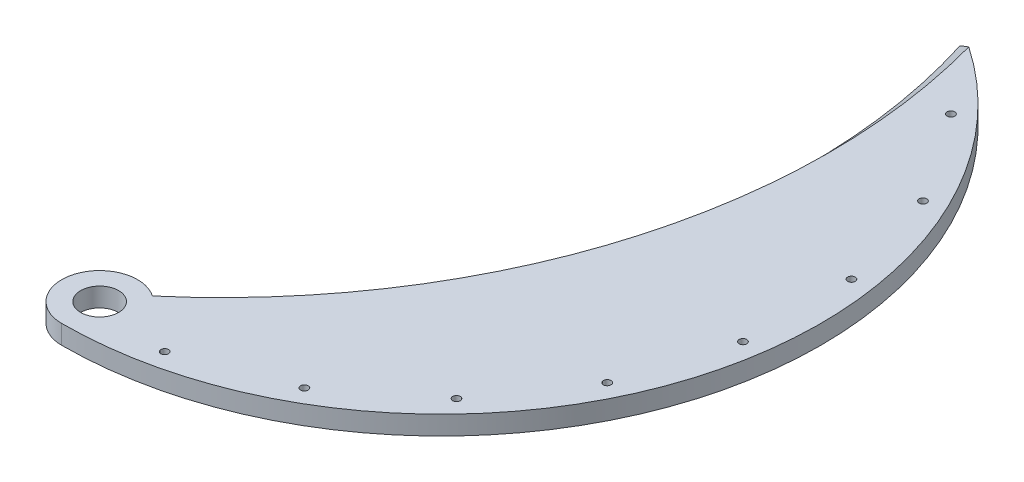
ISO-10303-21;
HEADER;
FILE_DESCRIPTION(('STEP AP214'),'2;1');
FILE_NAME('part.step','',(''),(''),'','','');
FILE_SCHEMA(('AUTOMOTIVE_DESIGN { 1 0 10303 214 1 1 1 1 }'));
ENDSEC;
DATA;
#1=APPLICATION_CONTEXT('core data for automotive mechanical design processes');
#2=APPLICATION_PROTOCOL_DEFINITION('international standard','automotive_design',2000,#1);
#3=PRODUCT_CONTEXT('',#1,'mechanical');
#4=PRODUCT('Part','Part','',(#3));
#5=PRODUCT_RELATED_PRODUCT_CATEGORY('part','',(#4));
#6=PRODUCT_DEFINITION_FORMATION('','',#4);
#7=PRODUCT_DEFINITION_CONTEXT('part definition',#1,'design');
#8=PRODUCT_DEFINITION('design','',#6,#7);
#9=PRODUCT_DEFINITION_SHAPE('','',#8);
#10=(LENGTH_UNIT() NAMED_UNIT(*) SI_UNIT(.MILLI.,.METRE.));
#11=(NAMED_UNIT(*) PLANE_ANGLE_UNIT() SI_UNIT($,.RADIAN.));
#12=(NAMED_UNIT(*) SI_UNIT($,.STERADIAN.) SOLID_ANGLE_UNIT());
#13=UNCERTAINTY_MEASURE_WITH_UNIT(LENGTH_MEASURE(1.E-05),#10,'distance_accuracy_value','');
#14=(GEOMETRIC_REPRESENTATION_CONTEXT(3) GLOBAL_UNCERTAINTY_ASSIGNED_CONTEXT((#13)) GLOBAL_UNIT_ASSIGNED_CONTEXT((#10,
#11,#12)) REPRESENTATION_CONTEXT('',''));
#15=CARTESIAN_POINT('',(0.,0.,0.));
#16=DIRECTION('',(0.,0.,1.));
#17=DIRECTION('',(1.,0.,0.));
#18=AXIS2_PLACEMENT_3D('',#15,#16,#17);
#19=CARTESIAN_POINT('',(0.,5.,0.));
#20=DIRECTION('',(0.,-1.,0.));
#21=DIRECTION('',(0.,0.,-1.));
#22=AXIS2_PLACEMENT_3D('',#19,#20,#21);
#23=CYLINDRICAL_SURFACE('',#22,10.);
#24=CARTESIAN_POINT('',(0.,0.,0.));
#25=DIRECTION('',(0.,1.,0.));
#26=DIRECTION('',(0.,0.,1.));
#27=AXIS2_PLACEMENT_3D('',#24,#25,#26);
#28=CIRCLE('',#27,10.);
#29=CARTESIAN_POINT('',(0.,0.,-10.));
#30=VERTEX_POINT('',#29);
#31=CARTESIAN_POINT('',(0.,0.,10.));
#32=VERTEX_POINT('',#31);
#33=EDGE_CURVE('E97',#30,#32,#28,.T.);
#34=ORIENTED_EDGE('',*,*,#33,.T.);
#35=DIRECTION('',(0.,-1.,0.));
#36=VECTOR('',#35,1.);
#37=CARTESIAN_POINT('',(0.,5.,10.));
#38=LINE('',#37,#36);
#39=CARTESIAN_POINT('',(0.,5.,10.));
#40=VERTEX_POINT('',#39);
#41=EDGE_CURVE('E88',#40,#32,#38,.T.);
#42=ORIENTED_EDGE('',*,*,#41,.F.);
#43=CARTESIAN_POINT('',(0.,5.,0.));
#44=DIRECTION('',(0.,1.,0.));
#45=DIRECTION('',(0.,0.,1.));
#46=AXIS2_PLACEMENT_3D('',#43,#44,#45);
#47=CIRCLE('',#46,10.);
#48=CARTESIAN_POINT('',(5.68600963770507,5.,-8.22613483963915));
#49=VERTEX_POINT('',#48);
#50=EDGE_CURVE('E70',#49,#40,#47,.T.);
#51=ORIENTED_EDGE('',*,*,#50,.F.);
#52=CARTESIAN_POINT('',(5.68600963770507,5.,-8.22613483963915));
#53=CARTESIAN_POINT('',(5.55977955708744,4.85178760313032,-8.31338223256118));
#54=CARTESIAN_POINT('',(5.43117303327143,4.70406442798496,-8.39798775645101));
#55=CARTESIAN_POINT('',(5.16921523305147,4.40976849499216,-8.56172240046287));
#56=CARTESIAN_POINT('',(5.03586353589763,4.26319584057378,-8.64085103311306));
#57=CARTESIAN_POINT('',(4.62839035758844,3.82512821442385,-8.86990491875302));
#58=CARTESIAN_POINT('',(4.34717350949888,3.53566335110463,-9.01127411915769));
#59=CARTESIAN_POINT('',(3.77247518610741,2.97035620703586,-9.2663447375317));
#60=CARTESIAN_POINT('',(3.47938439772671,2.69435499504607,-9.38057300430792));
#61=CARTESIAN_POINT('',(2.87606932151293,2.15201234494597,-9.58276552180022));
#62=CARTESIAN_POINT('',(2.56585713723499,1.88566429794838,-9.67074805149447));
#63=CARTESIAN_POINT('',(1.89467806462317,1.33755252291144,-9.82552911360594));
#64=CARTESIAN_POINT('',(1.53181764529904,1.05714994282893,-9.88909112237785));
#65=CARTESIAN_POINT('',(0.970977732611274,0.650054381797283,-9.95455609040276));
#66=CARTESIAN_POINT('',(0.780095321291611,0.515855433987899,-9.97140721790262));
#67=CARTESIAN_POINT('',(0.393552679639528,0.253316942688111,-9.99412684275101));
#68=CARTESIAN_POINT('',(0.197889772456412,0.124980803115009,-9.99998903709717));
#69=CARTESIAN_POINT('',(0.,0.,-10.));
#70=B_SPLINE_CURVE_WITH_KNOTS('',3,(#52,#53,#54,#55,#56,#57,#58,#59,#60,#61,#62,#63,#64,#65,#66,
#67,#68,#69),.UNSPECIFIED.,.F.,.F.,(4,2,2,2,2,2,2,2,4),(0.,0.639951913726444,1.27996071345663,
2.5616139853542,3.81586953474672,5.06924950097827,6.45556476250281,7.15705994485969,
7.85895736594476),.UNSPECIFIED.);
#71=EDGE_CURVE('E11',#49,#30,#70,.T.);
#72=ORIENTED_EDGE('',*,*,#71,.T.);
#73=EDGE_LOOP('',(#34,#42,#51,#72));
#74=FACE_BOUND('',#73,.T.);
#75=ADVANCED_FACE('F49',(#74),#23,.T.);
#76=CARTESIAN_POINT('',(0.,5.,-90.));
#77=DIRECTION('',(0.,-1.,0.));
#78=DIRECTION('',(0.,0.,-1.));
#79=AXIS2_PLACEMENT_3D('',#76,#77,#78);
#80=CYLINDRICAL_SURFACE('',#79,100.);
#81=CARTESIAN_POINT('',(0.,0.,-90.));
#82=DIRECTION('',(0.,1.,0.));
#83=DIRECTION('',(0.,0.,1.));
#84=AXIS2_PLACEMENT_3D('',#81,#82,#83);
#85=CIRCLE('',#84,100.);
#86=CARTESIAN_POINT('',(50.0000000000001,0.,-176.602540378444));
#87=VERTEX_POINT('',#86);
#88=EDGE_CURVE('E92',#87,#32,#85,.F.);
#89=ORIENTED_EDGE('',*,*,#88,.F.);
#90=CARTESIAN_POINT('',(50.0000000000001,0.,-176.602540378444));
#91=CARTESIAN_POINT('',(50.5416510738923,0.423130186841459,-176.289818392177));
#92=CARTESIAN_POINT('',(51.0812809867559,0.84470491002028,-175.971487042744));
#93=CARTESIAN_POINT('',(52.1561171044982,1.68455869558482,-175.323695713209));
#94=CARTESIAN_POINT('',(52.6913244836948,2.1028386313621,-174.99423881374));
#95=CARTESIAN_POINT('',(53.7572329372225,2.93615139468348,-174.324114069241));
#96=CARTESIAN_POINT('',(54.2879340031814,3.35118421619471,-173.983446203387));
#97=CARTESIAN_POINT('',(55.3447357837588,4.17804408069701,-173.290812771015));
#98=CARTESIAN_POINT('',(55.8708351944249,4.58987021160957,-172.938844126296));
#99=CARTESIAN_POINT('',(56.3944413551797,5.00000000000001,-172.581275021867));
#100=B_SPLINE_CURVE_WITH_KNOTS('',3,(#90,#91,#92,#93,#94,#95,#96,#97,#98,#99),.UNSPECIFIED.,.F.,
.F.,(4,2,2,2,4),(0.,2.26536478616403,4.53010736119314,6.79485414292467,9.06022313813868),.UNSPECIFIED.);
#101=CARTESIAN_POINT('',(56.3944413551797,5.,-172.581275021867));
#102=VERTEX_POINT('',#101);
#103=EDGE_CURVE('E78',#87,#102,#100,.T.);
#104=ORIENTED_EDGE('',*,*,#103,.T.);
#105=CARTESIAN_POINT('',(0.,5.,-90.));
#106=DIRECTION('',(0.,1.,0.));
#107=DIRECTION('',(0.,0.,1.));
#108=AXIS2_PLACEMENT_3D('',#105,#106,#107);
#109=CIRCLE('',#108,100.);
#110=EDGE_CURVE('E94',#102,#40,#109,.F.);
#111=ORIENTED_EDGE('',*,*,#110,.T.);
#112=ORIENTED_EDGE('',*,*,#41,.T.);
#113=EDGE_LOOP('',(#89,#104,#111,#112));
#114=FACE_BOUND('',#113,.T.);
#115=ADVANCED_FACE('F90',(#114),#80,.T.);
#116=CARTESIAN_POINT('',(0.,5.,0.));
#117=DIRECTION('',(0.,-1.,0.));
#118=DIRECTION('',(0.,0.,-1.));
#119=AXIS2_PLACEMENT_3D('',#116,#117,#118);
#120=CYLINDRICAL_SURFACE('',#119,5.);
#121=CARTESIAN_POINT('',(0.,5.,0.));
#122=DIRECTION('',(0.,1.,0.));
#123=DIRECTION('',(0.,0.,1.));
#124=AXIS2_PLACEMENT_3D('',#121,#122,#123);
#125=CIRCLE('',#124,5.);
#126=CARTESIAN_POINT('',(0.,5.,5.));
#127=VERTEX_POINT('',#126);
#128=EDGE_CURVE('E106',#127,#127,#125,.T.);
#129=ORIENTED_EDGE('',*,*,#128,.T.);
#130=EDGE_LOOP('',(#129));
#131=FACE_BOUND('',#130,.T.);
#132=CARTESIAN_POINT('',(0.,0.,0.));
#133=DIRECTION('',(0.,1.,0.));
#134=DIRECTION('',(0.,0.,1.));
#135=AXIS2_PLACEMENT_3D('',#132,#133,#134);
#136=CIRCLE('',#135,5.);
#137=CARTESIAN_POINT('',(0.,0.,5.));
#138=VERTEX_POINT('',#137);
#139=EDGE_CURVE('E101',#138,#138,#136,.T.);
#140=ORIENTED_EDGE('',*,*,#139,.F.);
#141=EDGE_LOOP('',(#140));
#142=FACE_BOUND('',#141,.T.);
#143=ADVANCED_FACE('F118',(#131,#142),#120,.F.);
#144=CARTESIAN_POINT('',(0.,5.,0.));
#145=DIRECTION('',(0.,1.,0.));
#146=DIRECTION('',(0.,0.,1.));
#147=AXIS2_PLACEMENT_3D('',#144,#145,#146);
#148=PLANE('',#147);
#149=CARTESIAN_POINT('',(20.,5.,2.87087810503354));
#150=DIRECTION('',(0.,1.,0.));
#151=DIRECTION('',(0.,0.,1.));
#152=AXIS2_PLACEMENT_3D('',#149,#150,#151);
#153=CIRCLE('',#152,0.999999999999994);
#154=CARTESIAN_POINT('',(20.,5.,3.87087810503353));
#155=VERTEX_POINT('',#154);
#156=EDGE_CURVE('E149',#155,#155,#153,.T.);
#157=ORIENTED_EDGE('',*,*,#156,.F.);
#158=EDGE_LOOP('',(#157));
#159=FACE_BOUND('',#158,.T.);
#160=CARTESIAN_POINT('',(46.6841565473824,5.,-7.26192214306948));
#161=DIRECTION('',(0.,1.,0.));
#162=DIRECTION('',(0.,0.,1.));
#163=AXIS2_PLACEMENT_3D('',#160,#161,#162);
#164=CIRCLE('',#163,0.999999999999984);
#165=CARTESIAN_POINT('',(46.6841565473824,5.,-6.26192214306949));
#166=VERTEX_POINT('',#165);
#167=EDGE_CURVE('E155',#166,#166,#164,.T.);
#168=ORIENTED_EDGE('',*,*,#167,.F.);
#169=EDGE_LOOP('',(#168));
#170=FACE_BOUND('',#169,.T.);
#171=CARTESIAN_POINT('',(69.1539734025778,5.,-24.863773807231));
#172=DIRECTION('',(0.,1.,0.));
#173=DIRECTION('',(0.,0.,1.));
#174=AXIS2_PLACEMENT_3D('',#171,#172,#173);
#175=CIRCLE('',#174,0.999999999999998);
#176=CARTESIAN_POINT('',(69.1539734025778,5.,-23.863773807231));
#177=VERTEX_POINT('',#176);
#178=EDGE_CURVE('E161',#177,#177,#175,.T.);
#179=ORIENTED_EDGE('',*,*,#178,.F.);
#180=EDGE_LOOP('',(#179));
#181=FACE_BOUND('',#180,.T.);
#182=CARTESIAN_POINT('',(85.3810227636849,5.,-48.3456970790876));
#183=DIRECTION('',(0.,1.,0.));
#184=DIRECTION('',(0.,0.,1.));
#185=AXIS2_PLACEMENT_3D('',#182,#183,#184);
#186=CIRCLE('',#185,0.999999999999998);
#187=CARTESIAN_POINT('',(85.3810227636849,5.,-47.3456970790876));
#188=VERTEX_POINT('',#187);
#189=EDGE_CURVE('E167',#188,#188,#186,.T.);
#190=ORIENTED_EDGE('',*,*,#189,.F.);
#191=EDGE_LOOP('',(#190));
#192=FACE_BOUND('',#191,.T.);
#193=CARTESIAN_POINT('',(93.9004329640134,5.,-75.5878978226344));
#194=DIRECTION('',(0.,1.,0.));
#195=DIRECTION('',(0.,0.,1.));
#196=AXIS2_PLACEMENT_3D('',#193,#194,#195);
#197=CIRCLE('',#196,0.999999999999998);
#198=CARTESIAN_POINT('',(93.9004329640134,5.,-74.5878978226344));
#199=VERTEX_POINT('',#198);
#200=EDGE_CURVE('E173',#199,#199,#197,.T.);
#201=ORIENTED_EDGE('',*,*,#200,.F.);
#202=EDGE_LOOP('',(#201));
#203=FACE_BOUND('',#202,.T.);
#204=CARTESIAN_POINT('',(93.9431274856054,5.,-104.131128696013));
#205=DIRECTION('',(0.,1.,0.));
#206=DIRECTION('',(0.,0.,1.));
#207=AXIS2_PLACEMENT_3D('',#204,#205,#206);
#208=CIRCLE('',#207,0.999999999999985);
#209=CARTESIAN_POINT('',(93.9431274856054,5.,-103.131128696013));
#210=VERTEX_POINT('',#209);
#211=EDGE_CURVE('E179',#210,#210,#208,.T.);
#212=ORIENTED_EDGE('',*,*,#211,.F.);
#213=EDGE_LOOP('',(#212));
#214=FACE_BOUND('',#213,.T.);
#215=CARTESIAN_POINT('',(69.3485230328133,5.,-154.929056308924));
#216=DIRECTION('',(0.,1.,0.));
#217=DIRECTION('',(0.,0.,1.));
#218=AXIS2_PLACEMENT_3D('',#215,#216,#217);
#219=CIRCLE('',#218,0.999999999999998);
#220=CARTESIAN_POINT('',(69.3485230328133,5.,-153.929056308924));
#221=VERTEX_POINT('',#220);
#222=EDGE_CURVE('E144',#221,#221,#219,.T.);
#223=ORIENTED_EDGE('',*,*,#222,.F.);
#224=EDGE_LOOP('',(#223));
#225=FACE_BOUND('',#224,.T.);
#226=CARTESIAN_POINT('',(85.5052521468651,5.,-131.398693883999));
#227=DIRECTION('',(0.,1.,0.));
#228=DIRECTION('',(0.,0.,1.));
#229=AXIS2_PLACEMENT_3D('',#226,#227,#228);
#230=CIRCLE('',#229,1.00000000000001);
#231=CARTESIAN_POINT('',(85.5052521468651,5.,-130.398693883999));
#232=VERTEX_POINT('',#231);
#233=EDGE_CURVE('E137',#232,#232,#230,.T.);
#234=ORIENTED_EDGE('',*,*,#233,.F.);
#235=EDGE_LOOP('',(#234));
#236=FACE_BOUND('',#235,.T.);
#237=ORIENTED_EDGE('',*,*,#128,.F.);
#238=EDGE_LOOP('',(#237));
#239=FACE_BOUND('',#238,.T.);
#240=ORIENTED_EDGE('',*,*,#110,.F.);
#241=CARTESIAN_POINT('',(-97.8852375608762,5.,-130.181031230602));
#242=DIRECTION('',(0.,1.,0.));
#243=DIRECTION('',(0.,0.,1.));
#244=AXIS2_PLACEMENT_3D('',#241,#242,#243);
#245=CIRCLE('',#244,160.);
#246=EDGE_CURVE('E64',#102,#49,#245,.F.);
#247=ORIENTED_EDGE('',*,*,#246,.T.);
#248=ORIENTED_EDGE('',*,*,#50,.T.);
#249=EDGE_LOOP('',(#240,#247,#248));
#250=FACE_BOUND('',#249,.T.);
#251=ADVANCED_FACE('F123',(#159,#170,#181,#192,#203,#214,#225,#236,#239,#250),#148,.T.);
#252=CARTESIAN_POINT('',(0.,0.,0.));
#253=DIRECTION('',(0.,1.,0.));
#254=DIRECTION('',(0.,0.,1.));
#255=AXIS2_PLACEMENT_3D('',#252,#253,#254);
#256=PLANE('',#255);
#257=CARTESIAN_POINT('',(20.,0.,2.87087810503354));
#258=DIRECTION('',(0.,1.,0.));
#259=DIRECTION('',(0.,0.,1.));
#260=AXIS2_PLACEMENT_3D('',#257,#258,#259);
#261=CIRCLE('',#260,0.999999999999994);
#262=CARTESIAN_POINT('',(20.,0.,3.87087810503353));
#263=VERTEX_POINT('',#262);
#264=EDGE_CURVE('E146',#263,#263,#261,.T.);
#265=ORIENTED_EDGE('',*,*,#264,.T.);
#266=EDGE_LOOP('',(#265));
#267=FACE_BOUND('',#266,.T.);
#268=CARTESIAN_POINT('',(46.6841565473824,0.,-7.26192214306948));
#269=DIRECTION('',(0.,1.,0.));
#270=DIRECTION('',(0.,0.,1.));
#271=AXIS2_PLACEMENT_3D('',#268,#269,#270);
#272=CIRCLE('',#271,0.999999999999984);
#273=CARTESIAN_POINT('',(46.6841565473824,0.,-6.26192214306949));
#274=VERTEX_POINT('',#273);
#275=EDGE_CURVE('E152',#274,#274,#272,.T.);
#276=ORIENTED_EDGE('',*,*,#275,.T.);
#277=EDGE_LOOP('',(#276));
#278=FACE_BOUND('',#277,.T.);
#279=CARTESIAN_POINT('',(69.1539734025778,0.,-24.863773807231));
#280=DIRECTION('',(0.,1.,0.));
#281=DIRECTION('',(0.,0.,1.));
#282=AXIS2_PLACEMENT_3D('',#279,#280,#281);
#283=CIRCLE('',#282,0.999999999999998);
#284=CARTESIAN_POINT('',(69.1539734025778,0.,-23.863773807231));
#285=VERTEX_POINT('',#284);
#286=EDGE_CURVE('E158',#285,#285,#283,.T.);
#287=ORIENTED_EDGE('',*,*,#286,.T.);
#288=EDGE_LOOP('',(#287));
#289=FACE_BOUND('',#288,.T.);
#290=CARTESIAN_POINT('',(85.3810227636849,0.,-48.3456970790876));
#291=DIRECTION('',(0.,1.,0.));
#292=DIRECTION('',(0.,0.,1.));
#293=AXIS2_PLACEMENT_3D('',#290,#291,#292);
#294=CIRCLE('',#293,0.999999999999998);
#295=CARTESIAN_POINT('',(85.3810227636849,0.,-47.3456970790876));
#296=VERTEX_POINT('',#295);
#297=EDGE_CURVE('E164',#296,#296,#294,.T.);
#298=ORIENTED_EDGE('',*,*,#297,.T.);
#299=EDGE_LOOP('',(#298));
#300=FACE_BOUND('',#299,.T.);
#301=CARTESIAN_POINT('',(93.9004329640134,0.,-75.5878978226344));
#302=DIRECTION('',(0.,1.,0.));
#303=DIRECTION('',(0.,0.,1.));
#304=AXIS2_PLACEMENT_3D('',#301,#302,#303);
#305=CIRCLE('',#304,0.999999999999998);
#306=CARTESIAN_POINT('',(93.9004329640134,0.,-74.5878978226344));
#307=VERTEX_POINT('',#306);
#308=EDGE_CURVE('E170',#307,#307,#305,.T.);
#309=ORIENTED_EDGE('',*,*,#308,.T.);
#310=EDGE_LOOP('',(#309));
#311=FACE_BOUND('',#310,.T.);
#312=CARTESIAN_POINT('',(93.9431274856054,0.,-104.131128696013));
#313=DIRECTION('',(0.,1.,0.));
#314=DIRECTION('',(0.,0.,1.));
#315=AXIS2_PLACEMENT_3D('',#312,#313,#314);
#316=CIRCLE('',#315,0.999999999999985);
#317=CARTESIAN_POINT('',(93.9431274856054,0.,-103.131128696013));
#318=VERTEX_POINT('',#317);
#319=EDGE_CURVE('E176',#318,#318,#316,.T.);
#320=ORIENTED_EDGE('',*,*,#319,.T.);
#321=EDGE_LOOP('',(#320));
#322=FACE_BOUND('',#321,.T.);
#323=CARTESIAN_POINT('',(69.3485230328133,0.,-154.929056308924));
#324=DIRECTION('',(0.,1.,0.));
#325=DIRECTION('',(0.,0.,1.));
#326=AXIS2_PLACEMENT_3D('',#323,#324,#325);
#327=CIRCLE('',#326,0.999999999999998);
#328=CARTESIAN_POINT('',(69.3485230328133,0.,-153.929056308924));
#329=VERTEX_POINT('',#328);
#330=EDGE_CURVE('E182',#329,#329,#327,.T.);
#331=ORIENTED_EDGE('',*,*,#330,.T.);
#332=EDGE_LOOP('',(#331));
#333=FACE_BOUND('',#332,.T.);
#334=CARTESIAN_POINT('',(85.5052521468651,0.,-131.398693883999));
#335=DIRECTION('',(0.,1.,0.));
#336=DIRECTION('',(0.,0.,1.));
#337=AXIS2_PLACEMENT_3D('',#334,#335,#336);
#338=CIRCLE('',#337,1.00000000000001);
#339=CARTESIAN_POINT('',(85.5052521468651,0.,-130.398693883999));
#340=VERTEX_POINT('',#339);
#341=EDGE_CURVE('E135',#340,#340,#338,.T.);
#342=ORIENTED_EDGE('',*,*,#341,.T.);
#343=EDGE_LOOP('',(#342));
#344=FACE_BOUND('',#343,.T.);
#345=ORIENTED_EDGE('',*,*,#139,.T.);
#346=EDGE_LOOP('',(#345));
#347=FACE_BOUND('',#346,.T.);
#348=ORIENTED_EDGE('',*,*,#33,.F.);
#349=CARTESIAN_POINT('',(-97.8852375608762,0.,-130.181031230602));
#350=DIRECTION('',(0.,1.,0.));
#351=DIRECTION('',(0.,0.,1.));
#352=AXIS2_PLACEMENT_3D('',#349,#350,#351);
#353=CIRCLE('',#352,155.);
#354=EDGE_CURVE('E104',#30,#87,#353,.T.);
#355=ORIENTED_EDGE('',*,*,#354,.T.);
#356=ORIENTED_EDGE('',*,*,#88,.T.);
#357=EDGE_LOOP('',(#348,#355,#356));
#358=FACE_BOUND('',#357,.T.);
#359=ADVANCED_FACE('F103',(#267,#278,#289,#300,#311,#322,#333,#344,#347,#358),#256,.F.);
#360=CARTESIAN_POINT('',(-97.8852375608762,0.,-130.181031230602));
#361=DIRECTION('',(0.,1.,0.));
#362=DIRECTION('',(0.,0.,1.));
#363=AXIS2_PLACEMENT_3D('',#360,#361,#362);
#364=CONICAL_SURFACE('',#363,155.,0.785398163397451);
#365=ORIENTED_EDGE('',*,*,#71,.F.);
#366=ORIENTED_EDGE('',*,*,#246,.F.);
#367=ORIENTED_EDGE('',*,*,#103,.F.);
#368=ORIENTED_EDGE('',*,*,#354,.F.);
#369=EDGE_LOOP('',(#365,#366,#367,#368));
#370=FACE_BOUND('',#369,.T.);
#371=ADVANCED_FACE('F52',(#370),#364,.F.);
#372=CARTESIAN_POINT('',(85.5052521468651,0.,-131.398693883999));
#373=DIRECTION('',(0.,1.,0.));
#374=DIRECTION('',(0.,0.,1.));
#375=AXIS2_PLACEMENT_3D('',#372,#373,#374);
#376=CYLINDRICAL_SURFACE('',#375,1.00000000000001);
#377=ORIENTED_EDGE('',*,*,#341,.F.);
#378=EDGE_LOOP('',(#377));
#379=FACE_BOUND('',#378,.T.);
#380=ORIENTED_EDGE('',*,*,#233,.T.);
#381=EDGE_LOOP('',(#380));
#382=FACE_BOUND('',#381,.T.);
#383=ADVANCED_FACE('F197',(#379,#382),#376,.F.);
#384=CARTESIAN_POINT('',(69.3485230328133,0.,-154.929056308924));
#385=DIRECTION('',(0.,1.,0.));
#386=DIRECTION('',(0.,0.,1.));
#387=AXIS2_PLACEMENT_3D('',#384,#385,#386);
#388=CYLINDRICAL_SURFACE('',#387,0.999999999999998);
#389=ORIENTED_EDGE('',*,*,#330,.F.);
#390=EDGE_LOOP('',(#389));
#391=FACE_BOUND('',#390,.T.);
#392=ORIENTED_EDGE('',*,*,#222,.T.);
#393=EDGE_LOOP('',(#392));
#394=FACE_BOUND('',#393,.T.);
#395=ADVANCED_FACE('F188',(#391,#394),#388,.F.);
#396=CARTESIAN_POINT('',(93.9431274856054,0.,-104.131128696013));
#397=DIRECTION('',(0.,1.,0.));
#398=DIRECTION('',(0.,0.,1.));
#399=AXIS2_PLACEMENT_3D('',#396,#397,#398);
#400=CYLINDRICAL_SURFACE('',#399,0.999999999999985);
#401=ORIENTED_EDGE('',*,*,#319,.F.);
#402=EDGE_LOOP('',(#401));
#403=FACE_BOUND('',#402,.T.);
#404=ORIENTED_EDGE('',*,*,#211,.T.);
#405=EDGE_LOOP('',(#404));
#406=FACE_BOUND('',#405,.T.);
#407=ADVANCED_FACE('F225',(#403,#406),#400,.F.);
#408=CARTESIAN_POINT('',(93.9004329640134,0.,-75.5878978226344));
#409=DIRECTION('',(0.,1.,0.));
#410=DIRECTION('',(0.,0.,1.));
#411=AXIS2_PLACEMENT_3D('',#408,#409,#410);
#412=CYLINDRICAL_SURFACE('',#411,0.999999999999998);
#413=ORIENTED_EDGE('',*,*,#308,.F.);
#414=EDGE_LOOP('',(#413));
#415=FACE_BOUND('',#414,.T.);
#416=ORIENTED_EDGE('',*,*,#200,.T.);
#417=EDGE_LOOP('',(#416));
#418=FACE_BOUND('',#417,.T.);
#419=ADVANCED_FACE('F230',(#415,#418),#412,.F.);
#420=CARTESIAN_POINT('',(85.3810227636849,0.,-48.3456970790876));
#421=DIRECTION('',(0.,1.,0.));
#422=DIRECTION('',(0.,0.,1.));
#423=AXIS2_PLACEMENT_3D('',#420,#421,#422);
#424=CYLINDRICAL_SURFACE('',#423,0.999999999999998);
#425=ORIENTED_EDGE('',*,*,#297,.F.);
#426=EDGE_LOOP('',(#425));
#427=FACE_BOUND('',#426,.T.);
#428=ORIENTED_EDGE('',*,*,#189,.T.);
#429=EDGE_LOOP('',(#428));
#430=FACE_BOUND('',#429,.T.);
#431=ADVANCED_FACE('F236',(#427,#430),#424,.F.);
#432=CARTESIAN_POINT('',(69.1539734025778,0.,-24.863773807231));
#433=DIRECTION('',(0.,1.,0.));
#434=DIRECTION('',(0.,0.,1.));
#435=AXIS2_PLACEMENT_3D('',#432,#433,#434);
#436=CYLINDRICAL_SURFACE('',#435,0.999999999999998);
#437=ORIENTED_EDGE('',*,*,#286,.F.);
#438=EDGE_LOOP('',(#437));
#439=FACE_BOUND('',#438,.T.);
#440=ORIENTED_EDGE('',*,*,#178,.T.);
#441=EDGE_LOOP('',(#440));
#442=FACE_BOUND('',#441,.T.);
#443=ADVANCED_FACE('F240',(#439,#442),#436,.F.);
#444=CARTESIAN_POINT('',(46.6841565473824,0.,-7.26192214306948));
#445=DIRECTION('',(0.,1.,0.));
#446=DIRECTION('',(0.,0.,1.));
#447=AXIS2_PLACEMENT_3D('',#444,#445,#446);
#448=CYLINDRICAL_SURFACE('',#447,0.999999999999984);
#449=ORIENTED_EDGE('',*,*,#275,.F.);
#450=EDGE_LOOP('',(#449));
#451=FACE_BOUND('',#450,.T.);
#452=ORIENTED_EDGE('',*,*,#167,.T.);
#453=EDGE_LOOP('',(#452));
#454=FACE_BOUND('',#453,.T.);
#455=ADVANCED_FACE('F244',(#451,#454),#448,.F.);
#456=CARTESIAN_POINT('',(20.,0.,2.87087810503354));
#457=DIRECTION('',(0.,1.,0.));
#458=DIRECTION('',(0.,0.,1.));
#459=AXIS2_PLACEMENT_3D('',#456,#457,#458);
#460=CYLINDRICAL_SURFACE('',#459,0.999999999999994);
#461=ORIENTED_EDGE('',*,*,#264,.F.);
#462=EDGE_LOOP('',(#461));
#463=FACE_BOUND('',#462,.T.);
#464=ORIENTED_EDGE('',*,*,#156,.T.);
#465=EDGE_LOOP('',(#464));
#466=FACE_BOUND('',#465,.T.);
#467=ADVANCED_FACE('F248',(#463,#466),#460,.F.);
#468=CLOSED_SHELL('',(#75,#115,#143,#251,#359,#371,#383,#395,#407,#419,#431,#443,#455,#467));
#469=MANIFOLD_SOLID_BREP('B2',#468);
#470=ADVANCED_BREP_SHAPE_REPRESENTATION('',(#18,#469),#14);
#471=SHAPE_DEFINITION_REPRESENTATION(#9,#470);
ENDSEC;
END-ISO-10303-21;
